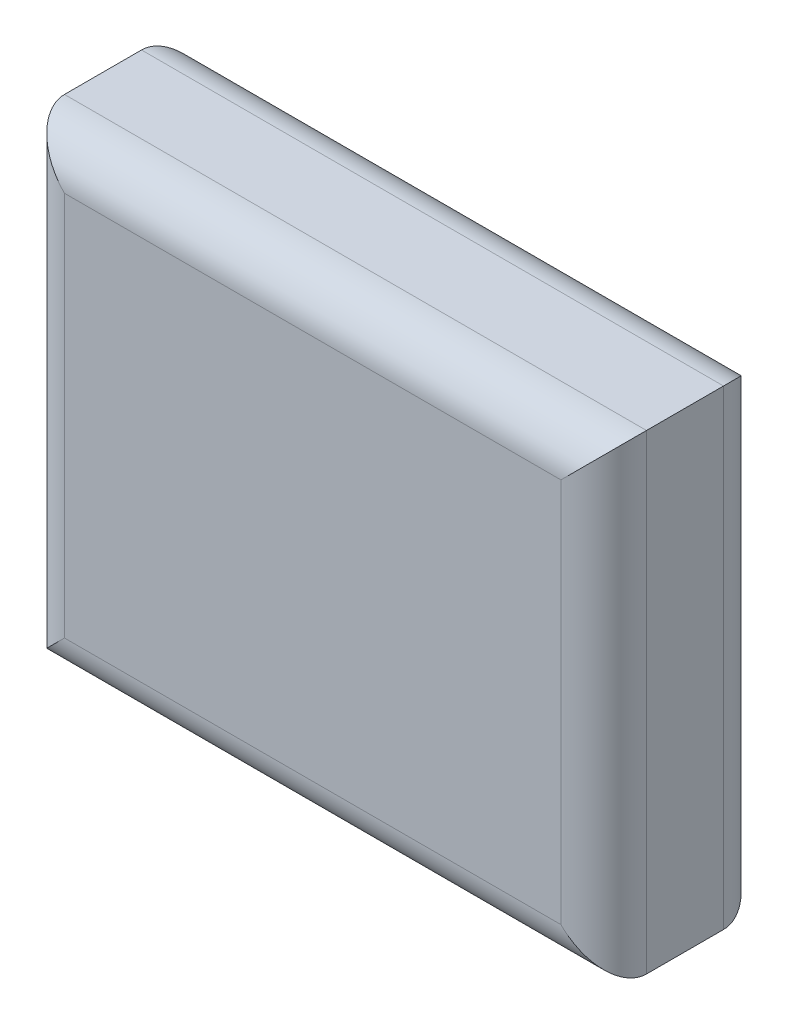
ISO-10303-21;
HEADER;
FILE_DESCRIPTION(('STEP AP214'),'2;1');
FILE_NAME('part.step','',(''),(''),'','','');
FILE_SCHEMA(('AUTOMOTIVE_DESIGN { 1 0 10303 214 1 1 1 1 }'));
ENDSEC;
DATA;
#1=APPLICATION_CONTEXT('core data for automotive mechanical design processes');
#2=APPLICATION_PROTOCOL_DEFINITION('international standard','automotive_design',2000,#1);
#3=PRODUCT_CONTEXT('',#1,'mechanical');
#4=PRODUCT('Part','Part','',(#3));
#5=PRODUCT_RELATED_PRODUCT_CATEGORY('part','',(#4));
#6=PRODUCT_DEFINITION_FORMATION('','',#4);
#7=PRODUCT_DEFINITION_CONTEXT('part definition',#1,'design');
#8=PRODUCT_DEFINITION('design','',#6,#7);
#9=PRODUCT_DEFINITION_SHAPE('','',#8);
#10=(LENGTH_UNIT() NAMED_UNIT(*) SI_UNIT(.MILLI.,.METRE.));
#11=(NAMED_UNIT(*) PLANE_ANGLE_UNIT() SI_UNIT($,.RADIAN.));
#12=(NAMED_UNIT(*) SI_UNIT($,.STERADIAN.) SOLID_ANGLE_UNIT());
#13=UNCERTAINTY_MEASURE_WITH_UNIT(LENGTH_MEASURE(1.E-05),#10,'distance_accuracy_value','');
#14=(GEOMETRIC_REPRESENTATION_CONTEXT(3) GLOBAL_UNCERTAINTY_ASSIGNED_CONTEXT((#13)) GLOBAL_UNIT_ASSIGNED_CONTEXT((#10,
#11,#12)) REPRESENTATION_CONTEXT('',''));
#15=CARTESIAN_POINT('',(0.,0.,0.));
#16=DIRECTION('',(0.,0.,1.));
#17=DIRECTION('',(1.,0.,0.));
#18=AXIS2_PLACEMENT_3D('',#15,#16,#17);
#19=CARTESIAN_POINT('',(-34.,-27.5,19.));
#20=DIRECTION('',(1.,0.,0.));
#21=DIRECTION('',(0.,0.,-1.));
#22=AXIS2_PLACEMENT_3D('',#19,#20,#21);
#23=PLANE('',#22);
#24=DIRECTION('',(0.,0.,-1.));
#25=VECTOR('',#24,1.);
#26=CARTESIAN_POINT('',(-34.,27.5,19.));
#27=LINE('',#26,#25);
#28=CARTESIAN_POINT('',(-34.,27.5,14.));
#29=VERTEX_POINT('',#28);
#30=CARTESIAN_POINT('',(-34.,27.5,5.));
#31=VERTEX_POINT('',#30);
#32=EDGE_CURVE('E158',#29,#31,#27,.T.);
#33=ORIENTED_EDGE('',*,*,#32,.T.);
#34=DIRECTION('',(0.,-1.,0.));
#35=VECTOR('',#34,1.);
#36=CARTESIAN_POINT('',(-34.,-27.5,5.));
#37=LINE('',#36,#35);
#38=CARTESIAN_POINT('',(-34.,-27.5,5.));
#39=VERTEX_POINT('',#38);
#40=EDGE_CURVE('E167',#31,#39,#37,.T.);
#41=ORIENTED_EDGE('',*,*,#40,.T.);
#42=DIRECTION('',(0.,0.,-1.));
#43=VECTOR('',#42,1.);
#44=CARTESIAN_POINT('',(-34.,-27.5,19.));
#45=LINE('',#44,#43);
#46=CARTESIAN_POINT('',(-34.,-27.5,14.));
#47=VERTEX_POINT('',#46);
#48=EDGE_CURVE('E135',#47,#39,#45,.T.);
#49=ORIENTED_EDGE('',*,*,#48,.F.);
#50=DIRECTION('',(0.,-1.,0.));
#51=VECTOR('',#50,1.);
#52=CARTESIAN_POINT('',(-34.,27.5,14.));
#53=LINE('',#52,#51);
#54=EDGE_CURVE('E169',#47,#29,#53,.F.);
#55=ORIENTED_EDGE('',*,*,#54,.T.);
#56=EDGE_LOOP('',(#33,#41,#49,#55));
#57=FACE_BOUND('',#56,.T.);
#58=ADVANCED_FACE('F45',(#57),#23,.F.);
#59=CARTESIAN_POINT('',(34.,-27.5,19.));
#60=DIRECTION('',(0.,1.,0.));
#61=DIRECTION('',(-1.,0.,0.));
#62=AXIS2_PLACEMENT_3D('',#59,#60,#61);
#63=PLANE('',#62);
#64=ORIENTED_EDGE('',*,*,#48,.T.);
#65=DIRECTION('',(1.,0.,0.));
#66=VECTOR('',#65,1.);
#67=CARTESIAN_POINT('',(34.,-27.5,5.));
#68=LINE('',#67,#66);
#69=CARTESIAN_POINT('',(34.,-27.5,5.));
#70=VERTEX_POINT('',#69);
#71=EDGE_CURVE('E134',#39,#70,#68,.T.);
#72=ORIENTED_EDGE('',*,*,#71,.T.);
#73=DIRECTION('',(0.,0.,-1.));
#74=VECTOR('',#73,1.);
#75=CARTESIAN_POINT('',(34.,-27.5,19.));
#76=LINE('',#75,#74);
#77=CARTESIAN_POINT('',(34.,-27.5,14.));
#78=VERTEX_POINT('',#77);
#79=EDGE_CURVE('E116',#78,#70,#76,.T.);
#80=ORIENTED_EDGE('',*,*,#79,.F.);
#81=DIRECTION('',(1.,0.,0.));
#82=VECTOR('',#81,1.);
#83=CARTESIAN_POINT('',(-34.,-27.5,14.));
#84=LINE('',#83,#82);
#85=EDGE_CURVE('E131',#78,#47,#84,.F.);
#86=ORIENTED_EDGE('',*,*,#85,.T.);
#87=EDGE_LOOP('',(#64,#72,#80,#86));
#88=FACE_BOUND('',#87,.T.);
#89=ADVANCED_FACE('F130',(#88),#63,.F.);
#90=CARTESIAN_POINT('',(34.,-27.5,19.));
#91=DIRECTION('',(-1.,0.,0.));
#92=DIRECTION('',(0.,0.,1.));
#93=AXIS2_PLACEMENT_3D('',#90,#91,#92);
#94=PLANE('',#93);
#95=ORIENTED_EDGE('',*,*,#79,.T.);
#96=DIRECTION('',(0.,1.,0.));
#97=VECTOR('',#96,1.);
#98=CARTESIAN_POINT('',(34.,-27.5,5.));
#99=LINE('',#98,#97);
#100=CARTESIAN_POINT('',(34.,27.5,5.));
#101=VERTEX_POINT('',#100);
#102=EDGE_CURVE('E123',#70,#101,#99,.T.);
#103=ORIENTED_EDGE('',*,*,#102,.T.);
#104=DIRECTION('',(0.,0.,-1.));
#105=VECTOR('',#104,1.);
#106=CARTESIAN_POINT('',(34.,27.5,19.));
#107=LINE('',#106,#105);
#108=CARTESIAN_POINT('',(34.,27.5,14.));
#109=VERTEX_POINT('',#108);
#110=EDGE_CURVE('E118',#109,#101,#107,.T.);
#111=ORIENTED_EDGE('',*,*,#110,.F.);
#112=DIRECTION('',(0.,1.,0.));
#113=VECTOR('',#112,1.);
#114=CARTESIAN_POINT('',(34.,-27.5,14.));
#115=LINE('',#114,#113);
#116=EDGE_CURVE('E113',#109,#78,#115,.F.);
#117=ORIENTED_EDGE('',*,*,#116,.T.);
#118=EDGE_LOOP('',(#95,#103,#111,#117));
#119=FACE_BOUND('',#118,.T.);
#120=ADVANCED_FACE('F115',(#119),#94,.F.);
#121=CARTESIAN_POINT('',(34.,27.5,19.));
#122=DIRECTION('',(0.,-1.,0.));
#123=DIRECTION('',(1.,0.,0.));
#124=AXIS2_PLACEMENT_3D('',#121,#122,#123);
#125=PLANE('',#124);
#126=ORIENTED_EDGE('',*,*,#110,.T.);
#127=DIRECTION('',(-1.,0.,0.));
#128=VECTOR('',#127,1.);
#129=CARTESIAN_POINT('',(34.,27.5,5.));
#130=LINE('',#129,#128);
#131=EDGE_CURVE('E171',#101,#31,#130,.T.);
#132=ORIENTED_EDGE('',*,*,#131,.T.);
#133=ORIENTED_EDGE('',*,*,#32,.F.);
#134=DIRECTION('',(-1.,0.,0.));
#135=VECTOR('',#134,1.);
#136=CARTESIAN_POINT('',(34.,27.5,14.));
#137=LINE('',#136,#135);
#138=EDGE_CURVE('E173',#29,#109,#137,.F.);
#139=ORIENTED_EDGE('',*,*,#138,.T.);
#140=EDGE_LOOP('',(#126,#132,#133,#139));
#141=FACE_BOUND('',#140,.T.);
#142=ADVANCED_FACE('F210',(#141),#125,.F.);
#143=CARTESIAN_POINT('',(0.,0.,19.));
#144=DIRECTION('',(0.,0.,1.));
#145=DIRECTION('',(1.,0.,0.));
#146=AXIS2_PLACEMENT_3D('',#143,#144,#145);
#147=PLANE('',#146);
#148=DIRECTION('',(0.,1.,0.));
#149=VECTOR('',#148,1.);
#150=CARTESIAN_POINT('',(29.,27.5,19.));
#151=LINE('',#150,#149);
#152=CARTESIAN_POINT('',(29.,-22.5,19.));
#153=VERTEX_POINT('',#152);
#154=CARTESIAN_POINT('',(29.,22.5,19.));
#155=VERTEX_POINT('',#154);
#156=EDGE_CURVE('E146',#153,#155,#151,.T.);
#157=ORIENTED_EDGE('',*,*,#156,.T.);
#158=DIRECTION('',(-1.,0.,0.));
#159=VECTOR('',#158,1.);
#160=CARTESIAN_POINT('',(-34.,22.5,19.));
#161=LINE('',#160,#159);
#162=CARTESIAN_POINT('',(-29.,22.5,19.));
#163=VERTEX_POINT('',#162);
#164=EDGE_CURVE('E11',#155,#163,#161,.T.);
#165=ORIENTED_EDGE('',*,*,#164,.T.);
#166=DIRECTION('',(0.,-1.,0.));
#167=VECTOR('',#166,1.);
#168=CARTESIAN_POINT('',(-29.,-27.5,19.));
#169=LINE('',#168,#167);
#170=CARTESIAN_POINT('',(-29.,-22.5,19.));
#171=VERTEX_POINT('',#170);
#172=EDGE_CURVE('E54',#163,#171,#169,.T.);
#173=ORIENTED_EDGE('',*,*,#172,.T.);
#174=DIRECTION('',(1.,0.,0.));
#175=VECTOR('',#174,1.);
#176=CARTESIAN_POINT('',(34.,-22.5,19.));
#177=LINE('',#176,#175);
#178=EDGE_CURVE('E164',#171,#153,#177,.T.);
#179=ORIENTED_EDGE('',*,*,#178,.T.);
#180=EDGE_LOOP('',(#157,#165,#173,#179));
#181=FACE_BOUND('',#180,.T.);
#182=ADVANCED_FACE('F213',(#181),#147,.T.);
#183=CARTESIAN_POINT('',(0.,0.,0.));
#184=DIRECTION('',(0.,0.,1.));
#185=DIRECTION('',(1.,0.,0.));
#186=AXIS2_PLACEMENT_3D('',#183,#184,#185);
#187=PLANE('',#186);
#188=DIRECTION('',(0.,1.,0.));
#189=VECTOR('',#188,1.);
#190=CARTESIAN_POINT('',(29.,0.,0.));
#191=LINE('',#190,#189);
#192=CARTESIAN_POINT('',(29.,22.5,0.));
#193=VERTEX_POINT('',#192);
#194=CARTESIAN_POINT('',(29.,-22.5,0.));
#195=VERTEX_POINT('',#194);
#196=EDGE_CURVE('E178',#193,#195,#191,.F.);
#197=ORIENTED_EDGE('',*,*,#196,.T.);
#198=DIRECTION('',(1.,0.,0.));
#199=VECTOR('',#198,1.);
#200=CARTESIAN_POINT('',(0.,-22.5,0.));
#201=LINE('',#200,#199);
#202=CARTESIAN_POINT('',(-29.,-22.5,0.));
#203=VERTEX_POINT('',#202);
#204=EDGE_CURVE('E124',#195,#203,#201,.F.);
#205=ORIENTED_EDGE('',*,*,#204,.T.);
#206=DIRECTION('',(0.,-1.,0.));
#207=VECTOR('',#206,1.);
#208=CARTESIAN_POINT('',(-29.,0.,0.));
#209=LINE('',#208,#207);
#210=CARTESIAN_POINT('',(-29.,22.5,0.));
#211=VERTEX_POINT('',#210);
#212=EDGE_CURVE('E182',#203,#211,#209,.F.);
#213=ORIENTED_EDGE('',*,*,#212,.T.);
#214=DIRECTION('',(-1.,0.,0.));
#215=VECTOR('',#214,1.);
#216=CARTESIAN_POINT('',(0.,22.5,0.));
#217=LINE('',#216,#215);
#218=EDGE_CURVE('E180',#211,#193,#217,.F.);
#219=ORIENTED_EDGE('',*,*,#218,.T.);
#220=EDGE_LOOP('',(#197,#205,#213,#219));
#221=FACE_BOUND('',#220,.T.);
#222=ADVANCED_FACE('F215',(#221),#187,.F.);
#223=CARTESIAN_POINT('',(34.,22.5,5.));
#224=DIRECTION('',(-1.,0.,0.));
#225=DIRECTION('',(0.,-1.,0.));
#226=AXIS2_PLACEMENT_3D('',#223,#224,#225);
#227=CYLINDRICAL_SURFACE('',#226,5.);
#228=CARTESIAN_POINT('',(29.,22.5,5.));
#229=DIRECTION('',(-0.707106781186548,0.707106781186547,0.));
#230=DIRECTION('',(-0.707106781186547,-0.707106781186547,0.));
#231=AXIS2_PLACEMENT_3D('',#228,#229,#230);
#232=ELLIPSE('',#231,7.07106781186548,5.);
#233=EDGE_CURVE('E159',#193,#101,#232,.F.);
#234=ORIENTED_EDGE('',*,*,#233,.F.);
#235=ORIENTED_EDGE('',*,*,#218,.F.);
#236=CARTESIAN_POINT('',(-29.,22.5,5.));
#237=DIRECTION('',(-0.707106781186547,-0.707106781186547,0.));
#238=DIRECTION('',(0.707106781186548,-0.707106781186547,0.));
#239=AXIS2_PLACEMENT_3D('',#236,#237,#238);
#240=ELLIPSE('',#239,7.07106781186547,5.);
#241=EDGE_CURVE('E155',#31,#211,#240,.T.);
#242=ORIENTED_EDGE('',*,*,#241,.F.);
#243=ORIENTED_EDGE('',*,*,#131,.F.);
#244=EDGE_LOOP('',(#234,#235,#242,#243));
#245=FACE_BOUND('',#244,.T.);
#246=ADVANCED_FACE('F197',(#245),#227,.T.);
#247=CARTESIAN_POINT('',(-29.,-27.5,5.));
#248=DIRECTION('',(0.,-1.,0.));
#249=DIRECTION('',(0.,0.,-1.));
#250=AXIS2_PLACEMENT_3D('',#247,#248,#249);
#251=CYLINDRICAL_SURFACE('',#250,5.);
#252=ORIENTED_EDGE('',*,*,#241,.T.);
#253=ORIENTED_EDGE('',*,*,#212,.F.);
#254=CARTESIAN_POINT('',(-29.,-22.5,5.));
#255=DIRECTION('',(0.707106781186548,-0.707106781186547,0.));
#256=DIRECTION('',(-0.707106781186547,-0.707106781186547,0.));
#257=AXIS2_PLACEMENT_3D('',#254,#255,#256);
#258=ELLIPSE('',#257,7.07106781186548,5.);
#259=EDGE_CURVE('E148',#39,#203,#258,.T.);
#260=ORIENTED_EDGE('',*,*,#259,.F.);
#261=ORIENTED_EDGE('',*,*,#40,.F.);
#262=EDGE_LOOP('',(#252,#253,#260,#261));
#263=FACE_BOUND('',#262,.T.);
#264=ADVANCED_FACE('F201',(#263),#251,.T.);
#265=CARTESIAN_POINT('',(29.,-27.5,5.));
#266=DIRECTION('',(0.,1.,0.));
#267=DIRECTION('',(0.,0.,1.));
#268=AXIS2_PLACEMENT_3D('',#265,#266,#267);
#269=CYLINDRICAL_SURFACE('',#268,5.);
#270=ORIENTED_EDGE('',*,*,#233,.T.);
#271=ORIENTED_EDGE('',*,*,#102,.F.);
#272=CARTESIAN_POINT('',(29.,-22.5,5.));
#273=DIRECTION('',(0.707106781186547,0.707106781186547,0.));
#274=DIRECTION('',(-0.707106781186548,0.707106781186547,0.));
#275=AXIS2_PLACEMENT_3D('',#272,#273,#274);
#276=ELLIPSE('',#275,7.07106781186547,5.);
#277=EDGE_CURVE('E147',#195,#70,#276,.F.);
#278=ORIENTED_EDGE('',*,*,#277,.F.);
#279=ORIENTED_EDGE('',*,*,#196,.F.);
#280=EDGE_LOOP('',(#270,#271,#278,#279));
#281=FACE_BOUND('',#280,.T.);
#282=ADVANCED_FACE('F209',(#281),#269,.T.);
#283=CARTESIAN_POINT('',(34.,-22.5,5.));
#284=DIRECTION('',(1.,0.,0.));
#285=DIRECTION('',(0.,1.,0.));
#286=AXIS2_PLACEMENT_3D('',#283,#284,#285);
#287=CYLINDRICAL_SURFACE('',#286,5.);
#288=ORIENTED_EDGE('',*,*,#259,.T.);
#289=ORIENTED_EDGE('',*,*,#204,.F.);
#290=ORIENTED_EDGE('',*,*,#277,.T.);
#291=ORIENTED_EDGE('',*,*,#71,.F.);
#292=EDGE_LOOP('',(#288,#289,#290,#291));
#293=FACE_BOUND('',#292,.T.);
#294=ADVANCED_FACE('F204',(#293),#287,.T.);
#295=CARTESIAN_POINT('',(0.,-22.5,14.));
#296=DIRECTION('',(-1.,0.,0.));
#297=DIRECTION('',(0.,-1.,0.));
#298=AXIS2_PLACEMENT_3D('',#295,#296,#297);
#299=CYLINDRICAL_SURFACE('',#298,5.);
#300=CARTESIAN_POINT('',(-29.,-22.5,14.));
#301=DIRECTION('',(-0.707106781186548,0.707106781186547,0.));
#302=DIRECTION('',(-0.707106781186547,-0.707106781186547,0.));
#303=AXIS2_PLACEMENT_3D('',#300,#301,#302);
#304=ELLIPSE('',#303,7.07106781186548,5.);
#305=EDGE_CURVE('E142',#47,#171,#304,.T.);
#306=ORIENTED_EDGE('',*,*,#305,.F.);
#307=ORIENTED_EDGE('',*,*,#85,.F.);
#308=CARTESIAN_POINT('',(29.,-22.5,14.));
#309=DIRECTION('',(-0.707106781186547,-0.707106781186547,0.));
#310=DIRECTION('',(0.707106781186548,-0.707106781186547,0.));
#311=AXIS2_PLACEMENT_3D('',#308,#309,#310);
#312=ELLIPSE('',#311,7.07106781186547,5.);
#313=EDGE_CURVE('E49',#153,#78,#312,.F.);
#314=ORIENTED_EDGE('',*,*,#313,.F.);
#315=ORIENTED_EDGE('',*,*,#178,.F.);
#316=EDGE_LOOP('',(#306,#307,#314,#315));
#317=FACE_BOUND('',#316,.T.);
#318=ADVANCED_FACE('F47',(#317),#299,.T.);
#319=CARTESIAN_POINT('',(29.,0.,14.));
#320=DIRECTION('',(0.,-1.,0.));
#321=DIRECTION('',(0.,0.,-1.));
#322=AXIS2_PLACEMENT_3D('',#319,#320,#321);
#323=CYLINDRICAL_SURFACE('',#322,5.);
#324=ORIENTED_EDGE('',*,*,#313,.T.);
#325=ORIENTED_EDGE('',*,*,#116,.F.);
#326=CARTESIAN_POINT('',(29.,22.5,14.));
#327=DIRECTION('',(0.707106781186548,-0.707106781186547,0.));
#328=DIRECTION('',(-0.707106781186547,-0.707106781186547,0.));
#329=AXIS2_PLACEMENT_3D('',#326,#327,#328);
#330=ELLIPSE('',#329,7.07106781186548,5.);
#331=EDGE_CURVE('E150',#155,#109,#330,.F.);
#332=ORIENTED_EDGE('',*,*,#331,.F.);
#333=ORIENTED_EDGE('',*,*,#156,.F.);
#334=EDGE_LOOP('',(#324,#325,#332,#333));
#335=FACE_BOUND('',#334,.T.);
#336=ADVANCED_FACE('F145',(#335),#323,.T.);
#337=CARTESIAN_POINT('',(-29.,0.,14.));
#338=DIRECTION('',(0.,1.,0.));
#339=DIRECTION('',(0.,0.,1.));
#340=AXIS2_PLACEMENT_3D('',#337,#338,#339);
#341=CYLINDRICAL_SURFACE('',#340,5.);
#342=ORIENTED_EDGE('',*,*,#305,.T.);
#343=ORIENTED_EDGE('',*,*,#172,.F.);
#344=CARTESIAN_POINT('',(-29.,22.5,14.));
#345=DIRECTION('',(0.707106781186547,0.707106781186547,0.));
#346=DIRECTION('',(-0.707106781186548,0.707106781186547,0.));
#347=AXIS2_PLACEMENT_3D('',#344,#345,#346);
#348=ELLIPSE('',#347,7.07106781186547,5.);
#349=EDGE_CURVE('E62',#29,#163,#348,.T.);
#350=ORIENTED_EDGE('',*,*,#349,.F.);
#351=ORIENTED_EDGE('',*,*,#54,.F.);
#352=EDGE_LOOP('',(#342,#343,#350,#351));
#353=FACE_BOUND('',#352,.T.);
#354=ADVANCED_FACE('F212',(#353),#341,.T.);
#355=CARTESIAN_POINT('',(0.,22.5,14.));
#356=DIRECTION('',(1.,0.,0.));
#357=DIRECTION('',(0.,1.,0.));
#358=AXIS2_PLACEMENT_3D('',#355,#356,#357);
#359=CYLINDRICAL_SURFACE('',#358,5.);
#360=ORIENTED_EDGE('',*,*,#331,.T.);
#361=ORIENTED_EDGE('',*,*,#138,.F.);
#362=ORIENTED_EDGE('',*,*,#349,.T.);
#363=ORIENTED_EDGE('',*,*,#164,.F.);
#364=EDGE_LOOP('',(#360,#361,#362,#363));
#365=FACE_BOUND('',#364,.T.);
#366=ADVANCED_FACE('F211',(#365),#359,.T.);
#367=CLOSED_SHELL('',(#58,#89,#120,#142,#182,#222,#246,#264,#282,#294,#318,#336,#354,#366));
#368=MANIFOLD_SOLID_BREP('B2',#367);
#369=ADVANCED_BREP_SHAPE_REPRESENTATION('',(#18,#368),#14);
#370=SHAPE_DEFINITION_REPRESENTATION(#9,#369);
ENDSEC;
END-ISO-10303-21;
